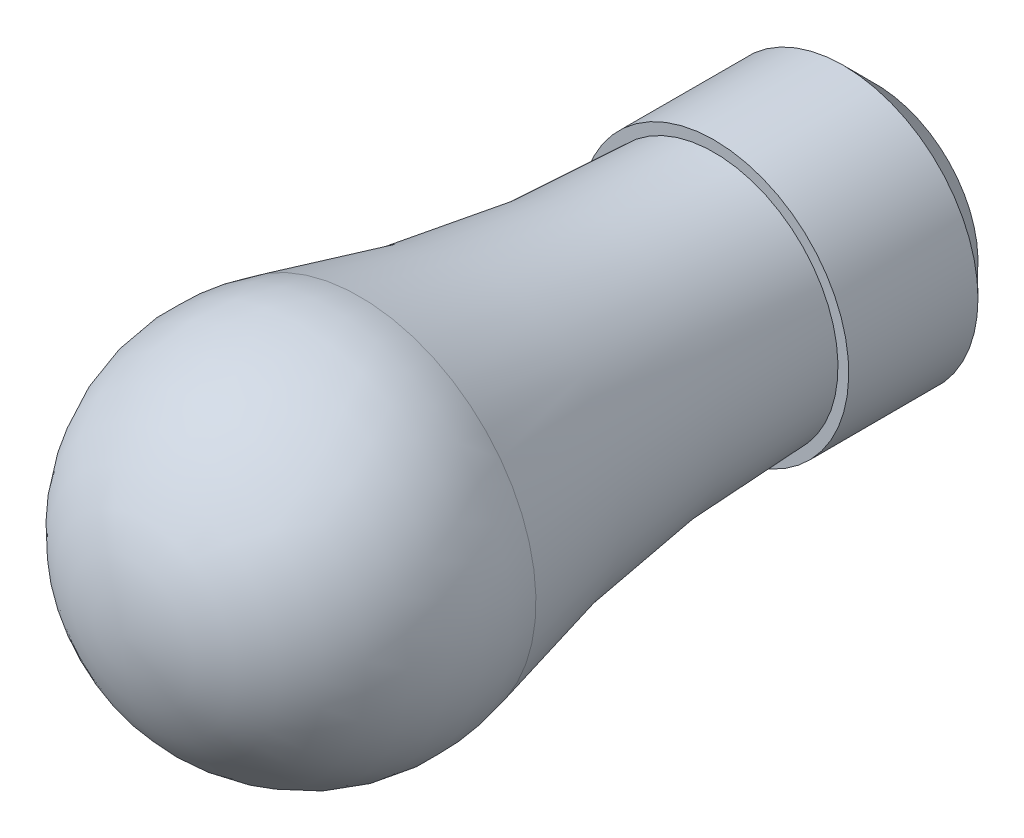
ISO-10303-21;
HEADER;
FILE_DESCRIPTION(('STEP AP214'),'2;1');
FILE_NAME('part.step','',(''),(''),'','','');
FILE_SCHEMA(('AUTOMOTIVE_DESIGN { 1 0 10303 214 1 1 1 1 }'));
ENDSEC;
DATA;
#1=APPLICATION_CONTEXT('core data for automotive mechanical design processes');
#2=APPLICATION_PROTOCOL_DEFINITION('international standard','automotive_design',2000,#1);
#3=PRODUCT_CONTEXT('',#1,'mechanical');
#4=PRODUCT('Part','Part','',(#3));
#5=PRODUCT_RELATED_PRODUCT_CATEGORY('part','',(#4));
#6=PRODUCT_DEFINITION_FORMATION('','',#4);
#7=PRODUCT_DEFINITION_CONTEXT('part definition',#1,'design');
#8=PRODUCT_DEFINITION('design','',#6,#7);
#9=PRODUCT_DEFINITION_SHAPE('','',#8);
#10=(LENGTH_UNIT() NAMED_UNIT(*) SI_UNIT(.MILLI.,.METRE.));
#11=(NAMED_UNIT(*) PLANE_ANGLE_UNIT() SI_UNIT($,.RADIAN.));
#12=(NAMED_UNIT(*) SI_UNIT($,.STERADIAN.) SOLID_ANGLE_UNIT());
#13=UNCERTAINTY_MEASURE_WITH_UNIT(LENGTH_MEASURE(1.E-05),#10,'distance_accuracy_value','');
#14=(GEOMETRIC_REPRESENTATION_CONTEXT(3) GLOBAL_UNCERTAINTY_ASSIGNED_CONTEXT((#13)) GLOBAL_UNIT_ASSIGNED_CONTEXT((#10,
#11,#12)) REPRESENTATION_CONTEXT('',''));
#15=CARTESIAN_POINT('',(0.,0.,0.));
#16=DIRECTION('',(0.,0.,1.));
#17=DIRECTION('',(1.,0.,0.));
#18=AXIS2_PLACEMENT_3D('',#15,#16,#17);
#19=CARTESIAN_POINT('',(0.,0.,52.8862116369118));
#20=DIRECTION('',(0.,0.,1.));
#21=DIRECTION('',(0.,-1.,0.));
#22=AXIS2_PLACEMENT_3D('',#19,#20,#21);
#23=SPHERICAL_SURFACE('',#22,17.1137883630882);
#24=CARTESIAN_POINT('',(0.,0.,47.9235017771985));
#25=DIRECTION('',(0.,0.,1.));
#26=DIRECTION('',(0.,-1.,0.));
#27=AXIS2_PLACEMENT_3D('',#24,#25,#26);
#28=CIRCLE('',#27,16.3784389666682);
#29=CARTESIAN_POINT('',(0.,-16.3784389666682,47.9235017771985));
#30=VERTEX_POINT('',#29);
#31=EDGE_CURVE('E62',#30,#30,#28,.T.);
#32=ORIENTED_EDGE('',*,*,#31,.T.);
#33=EDGE_LOOP('',(#32));
#34=FACE_BOUND('',#33,.T.);
#35=ADVANCED_FACE('F55',(#34),#23,.T.);
#36=CARTESIAN_POINT('',(0.,0.,15.));
#37=DIRECTION('',(0.,0.,-1.));
#38=DIRECTION('',(0.,1.,0.));
#39=AXIS2_PLACEMENT_3D('',#36,#37,#38);
#40=PLANE('',#39);
#41=CARTESIAN_POINT('',(0.,0.,15.));
#42=DIRECTION('',(0.,0.,1.));
#43=DIRECTION('',(0.,-1.,0.));
#44=AXIS2_PLACEMENT_3D('',#41,#42,#43);
#45=CIRCLE('',#44,11.5);
#46=CARTESIAN_POINT('',(0.,-11.5,15.));
#47=VERTEX_POINT('',#46);
#48=EDGE_CURVE('E11',#47,#47,#45,.T.);
#49=ORIENTED_EDGE('',*,*,#48,.F.);
#50=EDGE_LOOP('',(#49));
#51=FACE_BOUND('',#50,.T.);
#52=ADVANCED_FACE('F72',(#51),#40,.T.);
#53=CARTESIAN_POINT('',(0.,0.,15.));
#54=DIRECTION('',(0.,0.,1.));
#55=DIRECTION('',(0.,-1.,0.));
#56=AXIS2_PLACEMENT_3D('',#53,#54,#55);
#57=TOROIDAL_SURFACE('',#56,125.035922412211,113.535922412211);
#58=ORIENTED_EDGE('',*,*,#48,.T.);
#59=EDGE_LOOP('',(#58));
#60=FACE_BOUND('',#59,.T.);
#61=ORIENTED_EDGE('',*,*,#31,.F.);
#62=EDGE_LOOP('',(#61));
#63=FACE_BOUND('',#62,.T.);
#64=ADVANCED_FACE('F70',(#60,#63),#57,.F.);
#65=CLOSED_SHELL('',(#35,#52,#64));
#66=MANIFOLD_SOLID_BREP('B2',#65);
#67=CARTESIAN_POINT('',(0.,0.,0.));
#68=DIRECTION('',(0.,0.,1.));
#69=DIRECTION('',(0.,-1.,0.));
#70=AXIS2_PLACEMENT_3D('',#67,#68,#69);
#71=PLANE('',#70);
#72=CARTESIAN_POINT('',(0.,0.,0.));
#73=DIRECTION('',(0.,0.,1.));
#74=DIRECTION('',(0.,-1.,0.));
#75=AXIS2_PLACEMENT_3D('',#72,#73,#74);
#76=CIRCLE('',#75,9.5);
#77=CARTESIAN_POINT('',(0.,-9.5,0.));
#78=VERTEX_POINT('',#77);
#79=EDGE_CURVE('E106',#78,#78,#76,.F.);
#80=ORIENTED_EDGE('',*,*,#79,.T.);
#81=EDGE_LOOP('',(#80));
#82=FACE_BOUND('',#81,.T.);
#83=ADVANCED_FACE('F98',(#82),#71,.F.);
#84=CARTESIAN_POINT('',(0.,0.,0.));
#85=DIRECTION('',(0.,0.,-1.));
#86=DIRECTION('',(0.,1.,0.));
#87=AXIS2_PLACEMENT_3D('',#84,#85,#86);
#88=CYLINDRICAL_SURFACE('',#87,12.5);
#89=CARTESIAN_POINT('',(0.,0.,3.00000000000002));
#90=DIRECTION('',(0.,0.,1.));
#91=DIRECTION('',(0.,-1.,0.));
#92=AXIS2_PLACEMENT_3D('',#89,#90,#91);
#93=CIRCLE('',#92,12.5);
#94=CARTESIAN_POINT('',(0.,-12.5,3.00000000000002));
#95=VERTEX_POINT('',#94);
#96=EDGE_CURVE('E54',#95,#95,#93,.T.);
#97=ORIENTED_EDGE('',*,*,#96,.T.);
#98=EDGE_LOOP('',(#97));
#99=FACE_BOUND('',#98,.T.);
#100=CARTESIAN_POINT('',(0.,0.,15.));
#101=DIRECTION('',(0.,0.,-1.));
#102=DIRECTION('',(0.,1.,0.));
#103=AXIS2_PLACEMENT_3D('',#100,#101,#102);
#104=CIRCLE('',#103,12.5);
#105=CARTESIAN_POINT('',(0.,12.5,15.));
#106=VERTEX_POINT('',#105);
#107=EDGE_CURVE('E110',#106,#106,#104,.T.);
#108=ORIENTED_EDGE('',*,*,#107,.T.);
#109=EDGE_LOOP('',(#108));
#110=FACE_BOUND('',#109,.T.);
#111=ADVANCED_FACE('F117',(#99,#110),#88,.T.);
#112=CARTESIAN_POINT('',(0.,0.,15.));
#113=DIRECTION('',(0.,0.,-1.));
#114=DIRECTION('',(0.,1.,0.));
#115=AXIS2_PLACEMENT_3D('',#112,#113,#114);
#116=PLANE('',#115);
#117=ORIENTED_EDGE('',*,*,#107,.F.);
#118=EDGE_LOOP('',(#117));
#119=FACE_BOUND('',#118,.T.);
#120=ADVANCED_FACE('F119',(#119),#116,.F.);
#121=CARTESIAN_POINT('',(0.,0.,0.));
#122=DIRECTION('',(0.,0.,1.));
#123=DIRECTION('',(0.,-1.,0.));
#124=AXIS2_PLACEMENT_3D('',#121,#122,#123);
#125=CONICAL_SURFACE('',#124,9.5,0.785398163397446);
#126=ORIENTED_EDGE('',*,*,#96,.F.);
#127=EDGE_LOOP('',(#126));
#128=FACE_BOUND('',#127,.T.);
#129=ORIENTED_EDGE('',*,*,#79,.F.);
#130=EDGE_LOOP('',(#129));
#131=FACE_BOUND('',#130,.T.);
#132=ADVANCED_FACE('F101',(#128,#131),#125,.T.);
#133=CLOSED_SHELL('',(#83,#111,#120,#132));
#134=MANIFOLD_SOLID_BREP('B6',#133);
#135=ADVANCED_BREP_SHAPE_REPRESENTATION('',(#18,#66,#134),#14);
#136=SHAPE_DEFINITION_REPRESENTATION(#9,#135);
ENDSEC;
END-ISO-10303-21;
